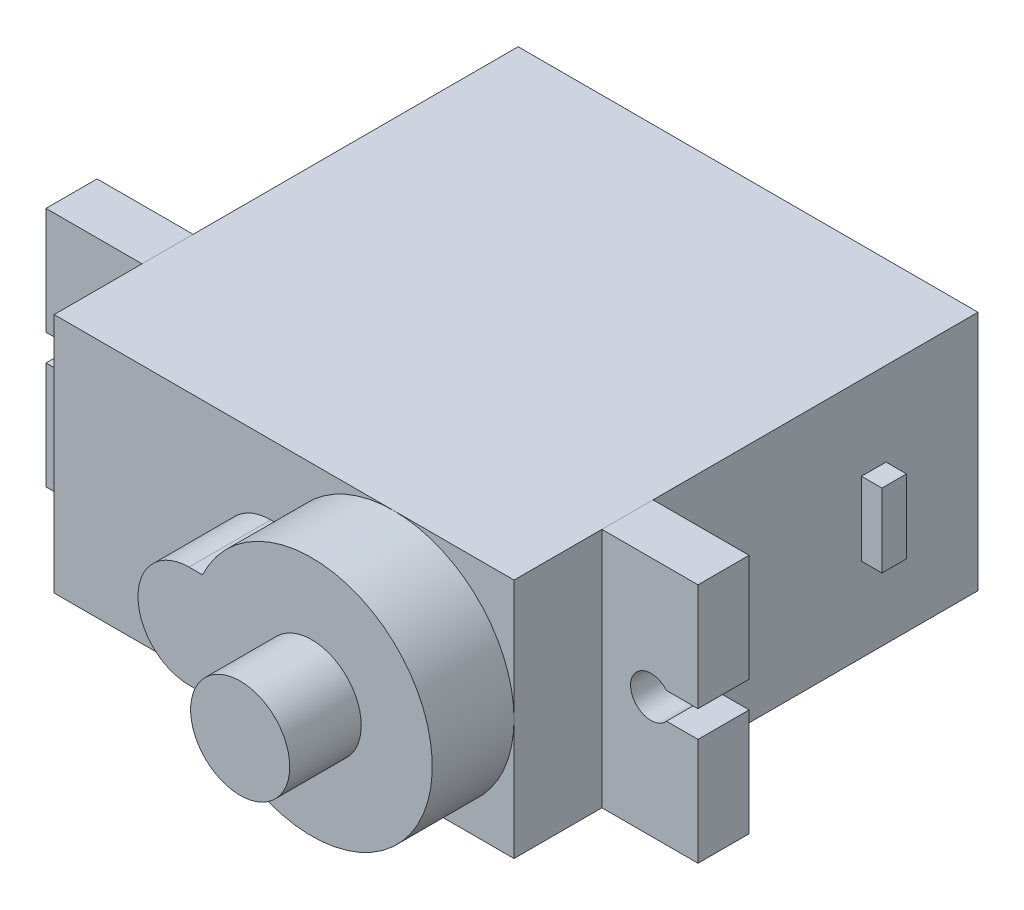
ISO-10303-21;
HEADER;
FILE_DESCRIPTION(('STEP AP214'),'2;1');
FILE_NAME('part.step','',(''),(''),'','','');
FILE_SCHEMA(('AUTOMOTIVE_DESIGN { 1 0 10303 214 1 1 1 1 }'));
ENDSEC;
DATA;
#1=APPLICATION_CONTEXT('core data for automotive mechanical design processes');
#2=APPLICATION_PROTOCOL_DEFINITION('international standard','automotive_design',2000,#1);
#3=PRODUCT_CONTEXT('',#1,'mechanical');
#4=PRODUCT('Part','Part','',(#3));
#5=PRODUCT_RELATED_PRODUCT_CATEGORY('part','',(#4));
#6=PRODUCT_DEFINITION_FORMATION('','',#4);
#7=PRODUCT_DEFINITION_CONTEXT('part definition',#1,'design');
#8=PRODUCT_DEFINITION('design','',#6,#7);
#9=PRODUCT_DEFINITION_SHAPE('','',#8);
#10=(LENGTH_UNIT() NAMED_UNIT(*) SI_UNIT(.MILLI.,.METRE.));
#11=(NAMED_UNIT(*) PLANE_ANGLE_UNIT() SI_UNIT($,.RADIAN.));
#12=(NAMED_UNIT(*) SI_UNIT($,.STERADIAN.) SOLID_ANGLE_UNIT());
#13=UNCERTAINTY_MEASURE_WITH_UNIT(LENGTH_MEASURE(1.E-05),#10,'distance_accuracy_value','');
#14=(GEOMETRIC_REPRESENTATION_CONTEXT(3) GLOBAL_UNCERTAINTY_ASSIGNED_CONTEXT((#13)) GLOBAL_UNIT_ASSIGNED_CONTEXT((#10,
#11,#12)) REPRESENTATION_CONTEXT('',''));
#15=CARTESIAN_POINT('',(0.,0.,0.));
#16=DIRECTION('',(0.,0.,1.));
#17=DIRECTION('',(1.,0.,0.));
#18=AXIS2_PLACEMENT_3D('',#15,#16,#17);
#19=CARTESIAN_POINT('',(13.65,0.,18.4));
#20=DIRECTION('',(0.,0.,-1.));
#21=DIRECTION('',(-1.,0.,0.));
#22=AXIS2_PLACEMENT_3D('',#19,#20,#21);
#23=CYLINDRICAL_SURFACE('',#22,1.);
#24=CARTESIAN_POINT('',(13.65,0.,15.9));
#25=DIRECTION('',(0.,0.,-1.));
#26=DIRECTION('',(-1.,0.,0.));
#27=AXIS2_PLACEMENT_3D('',#24,#25,#26);
#28=CIRCLE('',#27,1.);
#29=CARTESIAN_POINT('',(14.4099342076785,-0.650000000000027,15.9));
#30=VERTEX_POINT('',#29);
#31=CARTESIAN_POINT('',(14.4099342076785,0.649999999999973,15.9));
#32=VERTEX_POINT('',#31);
#33=EDGE_CURVE('E12',#30,#32,#28,.T.);
#34=ORIENTED_EDGE('',*,*,#33,.T.);
#35=DIRECTION('',(0.,0.,-1.));
#36=VECTOR('',#35,1.);
#37=CARTESIAN_POINT('',(14.4099342076785,0.649999999999973,18.4));
#38=LINE('',#37,#36);
#39=CARTESIAN_POINT('',(14.4099342076785,0.649999999999973,18.4));
#40=VERTEX_POINT('',#39);
#41=EDGE_CURVE('E184',#40,#32,#38,.T.);
#42=ORIENTED_EDGE('',*,*,#41,.F.);
#43=CARTESIAN_POINT('',(13.65,0.,18.4));
#44=DIRECTION('',(0.,0.,-1.));
#45=DIRECTION('',(-1.,0.,0.));
#46=AXIS2_PLACEMENT_3D('',#43,#44,#45);
#47=CIRCLE('',#46,1.);
#48=CARTESIAN_POINT('',(14.4099342076785,-0.650000000000027,18.4));
#49=VERTEX_POINT('',#48);
#50=EDGE_CURVE('E52',#49,#40,#47,.T.);
#51=ORIENTED_EDGE('',*,*,#50,.F.);
#52=DIRECTION('',(0.,0.,-1.));
#53=VECTOR('',#52,1.);
#54=CARTESIAN_POINT('',(14.4099342076785,-0.650000000000027,18.4));
#55=LINE('',#54,#53);
#56=EDGE_CURVE('E152',#49,#30,#55,.T.);
#57=ORIENTED_EDGE('',*,*,#56,.T.);
#58=EDGE_LOOP('',(#34,#42,#51,#57));
#59=FACE_BOUND('',#58,.T.);
#60=ADVANCED_FACE('F48',(#59),#23,.F.);
#61=CARTESIAN_POINT('',(15.95,0.64999999999997,18.4));
#62=DIRECTION('',(0.,1.,0.));
#63=DIRECTION('',(-1.,0.,0.));
#64=AXIS2_PLACEMENT_3D('',#61,#62,#63);
#65=PLANE('',#64);
#66=DIRECTION('',(1.,0.,0.));
#67=VECTOR('',#66,1.);
#68=CARTESIAN_POINT('',(15.95,0.64999999999997,15.9));
#69=LINE('',#68,#67);
#70=CARTESIAN_POINT('',(15.95,0.64999999999997,15.9));
#71=VERTEX_POINT('',#70);
#72=EDGE_CURVE('E58',#32,#71,#69,.T.);
#73=ORIENTED_EDGE('',*,*,#72,.T.);
#74=DIRECTION('',(0.,0.,-1.));
#75=VECTOR('',#74,1.);
#76=CARTESIAN_POINT('',(15.95,0.64999999999997,18.4));
#77=LINE('',#76,#75);
#78=CARTESIAN_POINT('',(15.95,0.64999999999997,18.4));
#79=VERTEX_POINT('',#78);
#80=EDGE_CURVE('E128',#79,#71,#77,.T.);
#81=ORIENTED_EDGE('',*,*,#80,.F.);
#82=DIRECTION('',(1.,0.,0.));
#83=VECTOR('',#82,1.);
#84=CARTESIAN_POINT('',(15.95,0.64999999999997,18.4));
#85=LINE('',#84,#83);
#86=EDGE_CURVE('E94',#40,#79,#85,.T.);
#87=ORIENTED_EDGE('',*,*,#86,.F.);
#88=ORIENTED_EDGE('',*,*,#41,.T.);
#89=EDGE_LOOP('',(#73,#81,#87,#88));
#90=FACE_BOUND('',#89,.T.);
#91=ADVANCED_FACE('F190',(#90),#65,.F.);
#92=CARTESIAN_POINT('',(15.95,5.89999999999997,18.4));
#93=DIRECTION('',(-1.,0.,0.));
#94=DIRECTION('',(0.,-1.,0.));
#95=AXIS2_PLACEMENT_3D('',#92,#93,#94);
#96=PLANE('',#95);
#97=DIRECTION('',(0.,1.,0.));
#98=VECTOR('',#97,1.);
#99=CARTESIAN_POINT('',(15.95,5.89999999999997,15.9));
#100=LINE('',#99,#98);
#101=CARTESIAN_POINT('',(15.95,5.89999999999997,15.9));
#102=VERTEX_POINT('',#101);
#103=EDGE_CURVE('E122',#71,#102,#100,.T.);
#104=ORIENTED_EDGE('',*,*,#103,.T.);
#105=DIRECTION('',(0.,0.,-1.));
#106=VECTOR('',#105,1.);
#107=CARTESIAN_POINT('',(15.95,5.89999999999997,18.4));
#108=LINE('',#107,#106);
#109=CARTESIAN_POINT('',(15.95,5.89999999999997,18.4));
#110=VERTEX_POINT('',#109);
#111=EDGE_CURVE('E126',#110,#102,#108,.T.);
#112=ORIENTED_EDGE('',*,*,#111,.F.);
#113=DIRECTION('',(0.,1.,0.));
#114=VECTOR('',#113,1.);
#115=CARTESIAN_POINT('',(15.95,5.89999999999997,18.4));
#116=LINE('',#115,#114);
#117=EDGE_CURVE('E159',#79,#110,#116,.T.);
#118=ORIENTED_EDGE('',*,*,#117,.F.);
#119=ORIENTED_EDGE('',*,*,#80,.T.);
#120=EDGE_LOOP('',(#104,#112,#118,#119));
#121=FACE_BOUND('',#120,.T.);
#122=ADVANCED_FACE('F124',(#121),#96,.F.);
#123=CARTESIAN_POINT('',(11.25,5.89999999999998,18.4));
#124=DIRECTION('',(0.,-1.,0.));
#125=DIRECTION('',(1.,0.,0.));
#126=AXIS2_PLACEMENT_3D('',#123,#124,#125);
#127=PLANE('',#126);
#128=DIRECTION('',(-1.,0.,0.));
#129=VECTOR('',#128,1.);
#130=CARTESIAN_POINT('',(11.25,5.89999999999998,15.9));
#131=LINE('',#130,#129);
#132=CARTESIAN_POINT('',(11.25,5.89999999999998,15.9));
#133=VERTEX_POINT('',#132);
#134=EDGE_CURVE('E130',#102,#133,#131,.T.);
#135=ORIENTED_EDGE('',*,*,#134,.T.);
#136=DIRECTION('',(0.,0.,-1.));
#137=VECTOR('',#136,1.);
#138=CARTESIAN_POINT('',(11.25,5.89999999999998,18.4));
#139=LINE('',#138,#137);
#140=CARTESIAN_POINT('',(11.25,5.89999999999998,18.4));
#141=VERTEX_POINT('',#140);
#142=EDGE_CURVE('E137',#141,#133,#139,.T.);
#143=ORIENTED_EDGE('',*,*,#142,.F.);
#144=DIRECTION('',(-1.,0.,0.));
#145=VECTOR('',#144,1.);
#146=CARTESIAN_POINT('',(11.25,5.89999999999998,18.4));
#147=LINE('',#146,#145);
#148=EDGE_CURVE('E136',#110,#141,#147,.T.);
#149=ORIENTED_EDGE('',*,*,#148,.F.);
#150=ORIENTED_EDGE('',*,*,#111,.T.);
#151=EDGE_LOOP('',(#135,#143,#149,#150));
#152=FACE_BOUND('',#151,.T.);
#153=ADVANCED_FACE('F133',(#152),#127,.F.);
#154=CARTESIAN_POINT('',(11.25,5.89999999999998,18.4));
#155=DIRECTION('',(1.,0.,0.));
#156=DIRECTION('',(0.,1.,0.));
#157=AXIS2_PLACEMENT_3D('',#154,#155,#156);
#158=PLANE('',#157);
#159=DIRECTION('',(0.,-1.,0.));
#160=VECTOR('',#159,1.);
#161=CARTESIAN_POINT('',(11.25,5.89999999999998,15.9));
#162=LINE('',#161,#160);
#163=CARTESIAN_POINT('',(11.25,-5.90000000000002,15.9));
#164=VERTEX_POINT('',#163);
#165=EDGE_CURVE('E142',#133,#164,#162,.T.);
#166=ORIENTED_EDGE('',*,*,#165,.T.);
#167=DIRECTION('',(0.,0.,-1.));
#168=VECTOR('',#167,1.);
#169=CARTESIAN_POINT('',(11.25,-5.90000000000002,18.4));
#170=LINE('',#169,#168);
#171=CARTESIAN_POINT('',(11.25,-5.90000000000002,18.4));
#172=VERTEX_POINT('',#171);
#173=EDGE_CURVE('E176',#172,#164,#170,.T.);
#174=ORIENTED_EDGE('',*,*,#173,.F.);
#175=DIRECTION('',(0.,-1.,0.));
#176=VECTOR('',#175,1.);
#177=CARTESIAN_POINT('',(11.25,5.89999999999998,18.4));
#178=LINE('',#177,#176);
#179=EDGE_CURVE('E156',#141,#172,#178,.T.);
#180=ORIENTED_EDGE('',*,*,#179,.F.);
#181=ORIENTED_EDGE('',*,*,#142,.T.);
#182=EDGE_LOOP('',(#166,#174,#180,#181));
#183=FACE_BOUND('',#182,.T.);
#184=ADVANCED_FACE('F193',(#183),#158,.F.);
#185=CARTESIAN_POINT('',(11.25,-5.90000000000002,18.4));
#186=DIRECTION('',(0.,1.,0.));
#187=DIRECTION('',(-1.,0.,0.));
#188=AXIS2_PLACEMENT_3D('',#185,#186,#187);
#189=PLANE('',#188);
#190=DIRECTION('',(1.,0.,0.));
#191=VECTOR('',#190,1.);
#192=CARTESIAN_POINT('',(11.25,-5.90000000000002,15.9));
#193=LINE('',#192,#191);
#194=CARTESIAN_POINT('',(15.95,-5.90000000000003,15.9));
#195=VERTEX_POINT('',#194);
#196=EDGE_CURVE('E144',#164,#195,#193,.T.);
#197=ORIENTED_EDGE('',*,*,#196,.T.);
#198=DIRECTION('',(0.,0.,-1.));
#199=VECTOR('',#198,1.);
#200=CARTESIAN_POINT('',(15.95,-5.90000000000003,18.4));
#201=LINE('',#200,#199);
#202=CARTESIAN_POINT('',(15.95,-5.90000000000003,18.4));
#203=VERTEX_POINT('',#202);
#204=EDGE_CURVE('E173',#203,#195,#201,.T.);
#205=ORIENTED_EDGE('',*,*,#204,.F.);
#206=DIRECTION('',(1.,0.,0.));
#207=VECTOR('',#206,1.);
#208=CARTESIAN_POINT('',(11.25,-5.90000000000002,18.4));
#209=LINE('',#208,#207);
#210=EDGE_CURVE('E154',#172,#203,#209,.T.);
#211=ORIENTED_EDGE('',*,*,#210,.F.);
#212=ORIENTED_EDGE('',*,*,#173,.T.);
#213=EDGE_LOOP('',(#197,#205,#211,#212));
#214=FACE_BOUND('',#213,.T.);
#215=ADVANCED_FACE('F171',(#214),#189,.F.);
#216=CARTESIAN_POINT('',(15.95,-0.65000000000003,18.4));
#217=DIRECTION('',(-1.,0.,0.));
#218=DIRECTION('',(0.,-1.,0.));
#219=AXIS2_PLACEMENT_3D('',#216,#217,#218);
#220=PLANE('',#219);
#221=DIRECTION('',(0.,1.,0.));
#222=VECTOR('',#221,1.);
#223=CARTESIAN_POINT('',(15.95,-0.65000000000003,15.9));
#224=LINE('',#223,#222);
#225=CARTESIAN_POINT('',(15.95,-0.65000000000003,15.9));
#226=VERTEX_POINT('',#225);
#227=EDGE_CURVE('E162',#195,#226,#224,.T.);
#228=ORIENTED_EDGE('',*,*,#227,.T.);
#229=DIRECTION('',(0.,0.,-1.));
#230=VECTOR('',#229,1.);
#231=CARTESIAN_POINT('',(15.95,-0.65000000000003,18.4));
#232=LINE('',#231,#230);
#233=CARTESIAN_POINT('',(15.95,-0.65000000000003,18.4));
#234=VERTEX_POINT('',#233);
#235=EDGE_CURVE('E181',#234,#226,#232,.T.);
#236=ORIENTED_EDGE('',*,*,#235,.F.);
#237=DIRECTION('',(0.,1.,0.));
#238=VECTOR('',#237,1.);
#239=CARTESIAN_POINT('',(15.95,-0.65000000000003,18.4));
#240=LINE('',#239,#238);
#241=EDGE_CURVE('E151',#203,#234,#240,.T.);
#242=ORIENTED_EDGE('',*,*,#241,.F.);
#243=ORIENTED_EDGE('',*,*,#204,.T.);
#244=EDGE_LOOP('',(#228,#236,#242,#243));
#245=FACE_BOUND('',#244,.T.);
#246=ADVANCED_FACE('F179',(#245),#220,.F.);
#247=CARTESIAN_POINT('',(14.4099342076785,-0.650000000000027,18.4));
#248=DIRECTION('',(0.,-1.,0.));
#249=DIRECTION('',(1.,0.,0.));
#250=AXIS2_PLACEMENT_3D('',#247,#248,#249);
#251=PLANE('',#250);
#252=DIRECTION('',(-1.,0.,0.));
#253=VECTOR('',#252,1.);
#254=CARTESIAN_POINT('',(14.4099342076785,-0.650000000000027,15.9));
#255=LINE('',#254,#253);
#256=EDGE_CURVE('E105',#226,#30,#255,.T.);
#257=ORIENTED_EDGE('',*,*,#256,.T.);
#258=ORIENTED_EDGE('',*,*,#56,.F.);
#259=DIRECTION('',(-1.,0.,0.));
#260=VECTOR('',#259,1.);
#261=CARTESIAN_POINT('',(14.4099342076785,-0.650000000000027,18.4));
#262=LINE('',#261,#260);
#263=EDGE_CURVE('E149',#234,#49,#262,.T.);
#264=ORIENTED_EDGE('',*,*,#263,.F.);
#265=ORIENTED_EDGE('',*,*,#235,.T.);
#266=EDGE_LOOP('',(#257,#258,#264,#265));
#267=FACE_BOUND('',#266,.T.);
#268=ADVANCED_FACE('F194',(#267),#251,.F.);
#269=CARTESIAN_POINT('',(13.65,0.,18.4));
#270=DIRECTION('',(0.,0.,-1.));
#271=DIRECTION('',(-1.,0.,0.));
#272=AXIS2_PLACEMENT_3D('',#269,#270,#271);
#273=PLANE('',#272);
#274=ORIENTED_EDGE('',*,*,#50,.T.);
#275=ORIENTED_EDGE('',*,*,#86,.T.);
#276=ORIENTED_EDGE('',*,*,#117,.T.);
#277=ORIENTED_EDGE('',*,*,#148,.T.);
#278=ORIENTED_EDGE('',*,*,#179,.T.);
#279=ORIENTED_EDGE('',*,*,#210,.T.);
#280=ORIENTED_EDGE('',*,*,#241,.T.);
#281=ORIENTED_EDGE('',*,*,#263,.T.);
#282=EDGE_LOOP('',(#274,#275,#276,#277,#278,#279,#280,#281));
#283=FACE_BOUND('',#282,.T.);
#284=ADVANCED_FACE('F50',(#283),#273,.F.);
#285=CARTESIAN_POINT('',(13.65,0.,15.9));
#286=DIRECTION('',(0.,0.,-1.));
#287=DIRECTION('',(-1.,0.,0.));
#288=AXIS2_PLACEMENT_3D('',#285,#286,#287);
#289=PLANE('',#288);
#290=ORIENTED_EDGE('',*,*,#33,.F.);
#291=ORIENTED_EDGE('',*,*,#256,.F.);
#292=ORIENTED_EDGE('',*,*,#227,.F.);
#293=ORIENTED_EDGE('',*,*,#196,.F.);
#294=ORIENTED_EDGE('',*,*,#165,.F.);
#295=ORIENTED_EDGE('',*,*,#134,.F.);
#296=ORIENTED_EDGE('',*,*,#103,.F.);
#297=ORIENTED_EDGE('',*,*,#72,.F.);
#298=EDGE_LOOP('',(#290,#291,#292,#293,#294,#295,#296,#297));
#299=FACE_BOUND('',#298,.T.);
#300=ADVANCED_FACE('F140',(#299),#289,.T.);
#301=CLOSED_SHELL('',(#60,#91,#122,#153,#184,#215,#246,#268,#284,#300));
#302=MANIFOLD_SOLID_BREP('B2',#301);
#303=CARTESIAN_POINT('',(-11.25,5.9,18.4));
#304=DIRECTION('',(-1.,0.,0.));
#305=DIRECTION('',(0.,0.,1.));
#306=AXIS2_PLACEMENT_3D('',#303,#304,#305);
#307=PLANE('',#306);
#308=DIRECTION('',(0.,1.,0.));
#309=VECTOR('',#308,1.);
#310=CARTESIAN_POINT('',(-11.25,5.9,15.9));
#311=LINE('',#310,#309);
#312=CARTESIAN_POINT('',(-11.25,-5.9,15.9));
#313=VERTEX_POINT('',#312);
#314=CARTESIAN_POINT('',(-11.25,5.9,15.9));
#315=VERTEX_POINT('',#314);
#316=EDGE_CURVE('E401',#313,#315,#311,.T.);
#317=ORIENTED_EDGE('',*,*,#316,.T.);
#318=DIRECTION('',(0.,0.,-1.));
#319=VECTOR('',#318,1.);
#320=CARTESIAN_POINT('',(-11.25,5.9,18.4));
#321=LINE('',#320,#319);
#322=CARTESIAN_POINT('',(-11.25,5.9,18.4));
#323=VERTEX_POINT('',#322);
#324=EDGE_CURVE('E46',#323,#315,#321,.T.);
#325=ORIENTED_EDGE('',*,*,#324,.F.);
#326=DIRECTION('',(0.,1.,0.));
#327=VECTOR('',#326,1.);
#328=CARTESIAN_POINT('',(-11.25,5.9,18.4));
#329=LINE('',#328,#327);
#330=CARTESIAN_POINT('',(-11.25,-5.9,18.4));
#331=VERTEX_POINT('',#330);
#332=EDGE_CURVE('E415',#331,#323,#329,.T.);
#333=ORIENTED_EDGE('',*,*,#332,.F.);
#334=DIRECTION('',(0.,0.,-1.));
#335=VECTOR('',#334,1.);
#336=CARTESIAN_POINT('',(-11.25,-5.9,18.4));
#337=LINE('',#336,#335);
#338=EDGE_CURVE('E397',#331,#313,#337,.T.);
#339=ORIENTED_EDGE('',*,*,#338,.T.);
#340=EDGE_LOOP('',(#317,#325,#333,#339));
#341=FACE_BOUND('',#340,.T.);
#342=ADVANCED_FACE('F305',(#341),#307,.F.);
#343=CARTESIAN_POINT('',(-11.25,5.9,18.4));
#344=DIRECTION('',(0.,-1.,0.));
#345=DIRECTION('',(1.,0.,0.));
#346=AXIS2_PLACEMENT_3D('',#343,#344,#345);
#347=PLANE('',#346);
#348=DIRECTION('',(-1.,0.,0.));
#349=VECTOR('',#348,1.);
#350=CARTESIAN_POINT('',(-11.25,5.9,15.9));
#351=LINE('',#350,#349);
#352=CARTESIAN_POINT('',(-15.95,5.9,15.9));
#353=VERTEX_POINT('',#352);
#354=EDGE_CURVE('E404',#315,#353,#351,.T.);
#355=ORIENTED_EDGE('',*,*,#354,.T.);
#356=DIRECTION('',(0.,0.,-1.));
#357=VECTOR('',#356,1.);
#358=CARTESIAN_POINT('',(-15.95,5.9,18.4));
#359=LINE('',#358,#357);
#360=CARTESIAN_POINT('',(-15.95,5.9,18.4));
#361=VERTEX_POINT('',#360);
#362=EDGE_CURVE('E313',#361,#353,#359,.T.);
#363=ORIENTED_EDGE('',*,*,#362,.F.);
#364=DIRECTION('',(-1.,0.,0.));
#365=VECTOR('',#364,1.);
#366=CARTESIAN_POINT('',(-11.25,5.9,18.4));
#367=LINE('',#366,#365);
#368=EDGE_CURVE('E364',#323,#361,#367,.T.);
#369=ORIENTED_EDGE('',*,*,#368,.F.);
#370=ORIENTED_EDGE('',*,*,#324,.T.);
#371=EDGE_LOOP('',(#355,#363,#369,#370));
#372=FACE_BOUND('',#371,.T.);
#373=ADVANCED_FACE('F450',(#372),#347,.F.);
#374=CARTESIAN_POINT('',(-15.95,5.9,18.4));
#375=DIRECTION('',(1.,0.,0.));
#376=DIRECTION('',(0.,1.,0.));
#377=AXIS2_PLACEMENT_3D('',#374,#375,#376);
#378=PLANE('',#377);
#379=DIRECTION('',(0.,-1.,0.));
#380=VECTOR('',#379,1.);
#381=CARTESIAN_POINT('',(-15.95,5.9,15.9));
#382=LINE('',#381,#380);
#383=CARTESIAN_POINT('',(-15.95,0.649999999999998,15.9));
#384=VERTEX_POINT('',#383);
#385=EDGE_CURVE('E406',#353,#384,#382,.T.);
#386=ORIENTED_EDGE('',*,*,#385,.T.);
#387=DIRECTION('',(0.,0.,-1.));
#388=VECTOR('',#387,1.);
#389=CARTESIAN_POINT('',(-15.95,0.649999999999998,18.4));
#390=LINE('',#389,#388);
#391=CARTESIAN_POINT('',(-15.95,0.649999999999998,18.4));
#392=VERTEX_POINT('',#391);
#393=EDGE_CURVE('E422',#392,#384,#390,.T.);
#394=ORIENTED_EDGE('',*,*,#393,.F.);
#395=DIRECTION('',(0.,-1.,0.));
#396=VECTOR('',#395,1.);
#397=CARTESIAN_POINT('',(-15.95,5.9,18.4));
#398=LINE('',#397,#396);
#399=EDGE_CURVE('E430',#361,#392,#398,.T.);
#400=ORIENTED_EDGE('',*,*,#399,.F.);
#401=ORIENTED_EDGE('',*,*,#362,.T.);
#402=EDGE_LOOP('',(#386,#394,#400,#401));
#403=FACE_BOUND('',#402,.T.);
#404=ADVANCED_FACE('F428',(#403),#378,.F.);
#405=CARTESIAN_POINT('',(-15.95,0.649999999999998,18.4));
#406=DIRECTION('',(0.,1.,0.));
#407=DIRECTION('',(0.,0.,1.));
#408=AXIS2_PLACEMENT_3D('',#405,#406,#407);
#409=PLANE('',#408);
#410=DIRECTION('',(1.,0.,0.));
#411=VECTOR('',#410,1.);
#412=CARTESIAN_POINT('',(-15.95,0.649999999999998,15.9));
#413=LINE('',#412,#411);
#414=CARTESIAN_POINT('',(-14.4099342076785,0.649999999999998,15.9));
#415=VERTEX_POINT('',#414);
#416=EDGE_CURVE('E408',#384,#415,#413,.T.);
#417=ORIENTED_EDGE('',*,*,#416,.T.);
#418=DIRECTION('',(0.,0.,-1.));
#419=VECTOR('',#418,1.);
#420=CARTESIAN_POINT('',(-14.4099342076785,0.649999999999998,18.4));
#421=LINE('',#420,#419);
#422=CARTESIAN_POINT('',(-14.4099342076785,0.649999999999998,18.4));
#423=VERTEX_POINT('',#422);
#424=EDGE_CURVE('E419',#423,#415,#421,.T.);
#425=ORIENTED_EDGE('',*,*,#424,.F.);
#426=DIRECTION('',(1.,0.,0.));
#427=VECTOR('',#426,1.);
#428=CARTESIAN_POINT('',(-15.95,0.649999999999998,18.4));
#429=LINE('',#428,#427);
#430=EDGE_CURVE('E442',#392,#423,#429,.T.);
#431=ORIENTED_EDGE('',*,*,#430,.F.);
#432=ORIENTED_EDGE('',*,*,#393,.T.);
#433=EDGE_LOOP('',(#417,#425,#431,#432));
#434=FACE_BOUND('',#433,.T.);
#435=ADVANCED_FACE('F438',(#434),#409,.F.);
#436=CARTESIAN_POINT('',(-13.65,0.,18.4));
#437=DIRECTION('',(0.,0.,-1.));
#438=DIRECTION('',(-1.,0.,0.));
#439=AXIS2_PLACEMENT_3D('',#436,#437,#438);
#440=CYLINDRICAL_SURFACE('',#439,1.);
#441=CARTESIAN_POINT('',(-13.65,0.,15.9));
#442=DIRECTION('',(0.,0.,-1.));
#443=DIRECTION('',(1.,0.,0.));
#444=AXIS2_PLACEMENT_3D('',#441,#442,#443);
#445=CIRCLE('',#444,1.);
#446=CARTESIAN_POINT('',(-14.4099342076785,-0.650000000000002,15.9));
#447=VERTEX_POINT('',#446);
#448=EDGE_CURVE('E410',#415,#447,#445,.T.);
#449=ORIENTED_EDGE('',*,*,#448,.T.);
#450=DIRECTION('',(0.,0.,-1.));
#451=VECTOR('',#450,1.);
#452=CARTESIAN_POINT('',(-14.4099342076785,-0.650000000000002,18.4));
#453=LINE('',#452,#451);
#454=CARTESIAN_POINT('',(-14.4099342076785,-0.650000000000002,18.4));
#455=VERTEX_POINT('',#454);
#456=EDGE_CURVE('E392',#455,#447,#453,.T.);
#457=ORIENTED_EDGE('',*,*,#456,.F.);
#458=CARTESIAN_POINT('',(-13.65,0.,18.4));
#459=DIRECTION('',(0.,0.,-1.));
#460=DIRECTION('',(1.,0.,0.));
#461=AXIS2_PLACEMENT_3D('',#458,#459,#460);
#462=CIRCLE('',#461,1.);
#463=EDGE_CURVE('E383',#423,#455,#462,.T.);
#464=ORIENTED_EDGE('',*,*,#463,.F.);
#465=ORIENTED_EDGE('',*,*,#424,.T.);
#466=EDGE_LOOP('',(#449,#457,#464,#465));
#467=FACE_BOUND('',#466,.T.);
#468=ADVANCED_FACE('F441',(#467),#440,.F.);
#469=CARTESIAN_POINT('',(-14.4099342076785,-0.650000000000002,18.4));
#470=DIRECTION('',(0.,-1.,0.));
#471=DIRECTION('',(1.,0.,0.));
#472=AXIS2_PLACEMENT_3D('',#469,#470,#471);
#473=PLANE('',#472);
#474=DIRECTION('',(-1.,0.,0.));
#475=VECTOR('',#474,1.);
#476=CARTESIAN_POINT('',(-14.4099342076785,-0.650000000000002,15.9));
#477=LINE('',#476,#475);
#478=CARTESIAN_POINT('',(-15.95,-0.650000000000002,15.9));
#479=VERTEX_POINT('',#478);
#480=EDGE_CURVE('E391',#447,#479,#477,.T.);
#481=ORIENTED_EDGE('',*,*,#480,.T.);
#482=DIRECTION('',(0.,0.,-1.));
#483=VECTOR('',#482,1.);
#484=CARTESIAN_POINT('',(-15.95,-0.650000000000002,18.4));
#485=LINE('',#484,#483);
#486=CARTESIAN_POINT('',(-15.95,-0.650000000000002,18.4));
#487=VERTEX_POINT('',#486);
#488=EDGE_CURVE('E388',#487,#479,#485,.T.);
#489=ORIENTED_EDGE('',*,*,#488,.F.);
#490=DIRECTION('',(-1.,0.,0.));
#491=VECTOR('',#490,1.);
#492=CARTESIAN_POINT('',(-14.4099342076785,-0.650000000000002,18.4));
#493=LINE('',#492,#491);
#494=EDGE_CURVE('E377',#455,#487,#493,.T.);
#495=ORIENTED_EDGE('',*,*,#494,.F.);
#496=ORIENTED_EDGE('',*,*,#456,.T.);
#497=EDGE_LOOP('',(#481,#489,#495,#496));
#498=FACE_BOUND('',#497,.T.);
#499=ADVANCED_FACE('F389',(#498),#473,.F.);
#500=CARTESIAN_POINT('',(-15.95,-0.650000000000002,18.4));
#501=DIRECTION('',(1.,0.,0.));
#502=DIRECTION('',(0.,0.,-1.));
#503=AXIS2_PLACEMENT_3D('',#500,#501,#502);
#504=PLANE('',#503);
#505=DIRECTION('',(0.,-1.,0.));
#506=VECTOR('',#505,1.);
#507=CARTESIAN_POINT('',(-15.95,-0.650000000000002,15.9));
#508=LINE('',#507,#506);
#509=CARTESIAN_POINT('',(-15.95,-5.9,15.9));
#510=VERTEX_POINT('',#509);
#511=EDGE_CURVE('E350',#479,#510,#508,.T.);
#512=ORIENTED_EDGE('',*,*,#511,.T.);
#513=DIRECTION('',(0.,0.,-1.));
#514=VECTOR('',#513,1.);
#515=CARTESIAN_POINT('',(-15.95,-5.9,18.4));
#516=LINE('',#515,#514);
#517=CARTESIAN_POINT('',(-15.95,-5.9,18.4));
#518=VERTEX_POINT('',#517);
#519=EDGE_CURVE('E393',#518,#510,#516,.T.);
#520=ORIENTED_EDGE('',*,*,#519,.F.);
#521=DIRECTION('',(0.,-1.,0.));
#522=VECTOR('',#521,1.);
#523=CARTESIAN_POINT('',(-15.95,-0.650000000000002,18.4));
#524=LINE('',#523,#522);
#525=EDGE_CURVE('E381',#487,#518,#524,.T.);
#526=ORIENTED_EDGE('',*,*,#525,.F.);
#527=ORIENTED_EDGE('',*,*,#488,.T.);
#528=EDGE_LOOP('',(#512,#520,#526,#527));
#529=FACE_BOUND('',#528,.T.);
#530=ADVANCED_FACE('F395',(#529),#504,.F.);
#531=CARTESIAN_POINT('',(-11.25,-5.9,18.4));
#532=DIRECTION('',(0.,1.,0.));
#533=DIRECTION('',(-1.,0.,0.));
#534=AXIS2_PLACEMENT_3D('',#531,#532,#533);
#535=PLANE('',#534);
#536=DIRECTION('',(1.,0.,0.));
#537=VECTOR('',#536,1.);
#538=CARTESIAN_POINT('',(-11.25,-5.9,15.9));
#539=LINE('',#538,#537);
#540=EDGE_CURVE('E356',#510,#313,#539,.T.);
#541=ORIENTED_EDGE('',*,*,#540,.T.);
#542=ORIENTED_EDGE('',*,*,#338,.F.);
#543=DIRECTION('',(1.,0.,0.));
#544=VECTOR('',#543,1.);
#545=CARTESIAN_POINT('',(-11.25,-5.9,18.4));
#546=LINE('',#545,#544);
#547=EDGE_CURVE('E321',#518,#331,#546,.T.);
#548=ORIENTED_EDGE('',*,*,#547,.F.);
#549=ORIENTED_EDGE('',*,*,#519,.T.);
#550=EDGE_LOOP('',(#541,#542,#548,#549));
#551=FACE_BOUND('',#550,.T.);
#552=ADVANCED_FACE('F466',(#551),#535,.F.);
#553=CARTESIAN_POINT('',(-13.65,0.,18.4));
#554=DIRECTION('',(0.,0.,1.));
#555=DIRECTION('',(1.,0.,0.));
#556=AXIS2_PLACEMENT_3D('',#553,#554,#555);
#557=PLANE('',#556);
#558=ORIENTED_EDGE('',*,*,#332,.T.);
#559=ORIENTED_EDGE('',*,*,#368,.T.);
#560=ORIENTED_EDGE('',*,*,#399,.T.);
#561=ORIENTED_EDGE('',*,*,#430,.T.);
#562=ORIENTED_EDGE('',*,*,#463,.T.);
#563=ORIENTED_EDGE('',*,*,#494,.T.);
#564=ORIENTED_EDGE('',*,*,#525,.T.);
#565=ORIENTED_EDGE('',*,*,#547,.T.);
#566=EDGE_LOOP('',(#558,#559,#560,#561,#562,#563,#564,#565));
#567=FACE_BOUND('',#566,.T.);
#568=ADVANCED_FACE('F379',(#567),#557,.T.);
#569=CARTESIAN_POINT('',(-13.65,0.,15.9));
#570=DIRECTION('',(0.,0.,1.));
#571=DIRECTION('',(1.,0.,0.));
#572=AXIS2_PLACEMENT_3D('',#569,#570,#571);
#573=PLANE('',#572);
#574=ORIENTED_EDGE('',*,*,#316,.F.);
#575=ORIENTED_EDGE('',*,*,#540,.F.);
#576=ORIENTED_EDGE('',*,*,#511,.F.);
#577=ORIENTED_EDGE('',*,*,#480,.F.);
#578=ORIENTED_EDGE('',*,*,#448,.F.);
#579=ORIENTED_EDGE('',*,*,#416,.F.);
#580=ORIENTED_EDGE('',*,*,#385,.F.);
#581=ORIENTED_EDGE('',*,*,#354,.F.);
#582=EDGE_LOOP('',(#574,#575,#576,#577,#578,#579,#580,#581));
#583=FACE_BOUND('',#582,.T.);
#584=ADVANCED_FACE('F434',(#583),#573,.F.);
#585=CLOSED_SHELL('',(#342,#373,#404,#435,#468,#499,#530,#552,#568,#584));
#586=MANIFOLD_SOLID_BREP('B6',#585);
#587=CARTESIAN_POINT('',(11.25,-5.9,15.9));
#588=DIRECTION('',(-1.,0.,0.));
#589=DIRECTION('',(0.,0.,1.));
#590=AXIS2_PLACEMENT_3D('',#587,#588,#589);
#591=PLANE('',#590);
#592=DIRECTION('',(0.,1.,0.));
#593=VECTOR('',#592,1.);
#594=CARTESIAN_POINT('',(11.25,-5.9,0.));
#595=LINE('',#594,#593);
#596=CARTESIAN_POINT('',(11.25,-5.9,0.));
#597=VERTEX_POINT('',#596);
#598=CARTESIAN_POINT('',(11.25,5.9,0.));
#599=VERTEX_POINT('',#598);
#600=EDGE_CURVE('E730',#597,#599,#595,.T.);
#601=ORIENTED_EDGE('',*,*,#600,.T.);
#602=DIRECTION('',(0.,0.,-1.));
#603=VECTOR('',#602,1.);
#604=CARTESIAN_POINT('',(11.25,5.9,15.9));
#605=LINE('',#604,#603);
#606=CARTESIAN_POINT('',(11.25,5.9,22.7));
#607=VERTEX_POINT('',#606);
#608=EDGE_CURVE('E556',#607,#599,#605,.T.);
#609=ORIENTED_EDGE('',*,*,#608,.F.);
#610=DIRECTION('',(0.,-1.,0.));
#611=VECTOR('',#610,1.);
#612=CARTESIAN_POINT('',(11.25,-5.9,22.7));
#613=LINE('',#612,#611);
#614=CARTESIAN_POINT('',(11.25,0.,22.7));
#615=VERTEX_POINT('',#614);
#616=EDGE_CURVE('E723',#607,#615,#613,.T.);
#617=ORIENTED_EDGE('',*,*,#616,.T.);
#618=CARTESIAN_POINT('',(11.25,-5.9,22.7));
#619=VERTEX_POINT('',#618);
#620=EDGE_CURVE('E722',#615,#619,#613,.T.);
#621=ORIENTED_EDGE('',*,*,#620,.T.);
#622=DIRECTION('',(0.,0.,-1.));
#623=VECTOR('',#622,1.);
#624=CARTESIAN_POINT('',(11.25,-5.9,15.9));
#625=LINE('',#624,#623);
#626=EDGE_CURVE('E739',#619,#597,#625,.T.);
#627=ORIENTED_EDGE('',*,*,#626,.T.);
#628=EDGE_LOOP('',(#601,#609,#617,#621,#627));
#629=FACE_BOUND('',#628,.T.);
#630=DIRECTION('',(0.,1.,0.));
#631=VECTOR('',#630,1.);
#632=CARTESIAN_POINT('',(11.25,-1.8,4.5));
#633=LINE('',#632,#631);
#634=CARTESIAN_POINT('',(11.25,-1.8,4.5));
#635=VERTEX_POINT('',#634);
#636=CARTESIAN_POINT('',(11.25,1.8,4.5));
#637=VERTEX_POINT('',#636);
#638=EDGE_CURVE('E672',#635,#637,#633,.T.);
#639=ORIENTED_EDGE('',*,*,#638,.F.);
#640=DIRECTION('',(0.,0.,-1.));
#641=VECTOR('',#640,1.);
#642=CARTESIAN_POINT('',(11.25,-1.8,5.7));
#643=LINE('',#642,#641);
#644=CARTESIAN_POINT('',(11.25,-1.8,5.7));
#645=VERTEX_POINT('',#644);
#646=EDGE_CURVE('E669',#645,#635,#643,.T.);
#647=ORIENTED_EDGE('',*,*,#646,.F.);
#648=DIRECTION('',(0.,-1.,0.));
#649=VECTOR('',#648,1.);
#650=CARTESIAN_POINT('',(11.25,-1.8,5.7));
#651=LINE('',#650,#649);
#652=CARTESIAN_POINT('',(11.25,1.8,5.7));
#653=VERTEX_POINT('',#652);
#654=EDGE_CURVE('E574',#653,#645,#651,.T.);
#655=ORIENTED_EDGE('',*,*,#654,.F.);
#656=DIRECTION('',(0.,0.,1.));
#657=VECTOR('',#656,1.);
#658=CARTESIAN_POINT('',(11.25,1.8,5.7));
#659=LINE('',#658,#657);
#660=EDGE_CURVE('E569',#637,#653,#659,.T.);
#661=ORIENTED_EDGE('',*,*,#660,.F.);
#662=EDGE_LOOP('',(#639,#647,#655,#661));
#663=FACE_BOUND('',#662,.T.);
#664=ADVANCED_FACE('F553',(#629,#663),#591,.F.);
#665=CARTESIAN_POINT('',(0.,0.,22.7));
#666=DIRECTION('',(0.,0.,1.));
#667=DIRECTION('',(1.,0.,0.));
#668=AXIS2_PLACEMENT_3D('',#665,#666,#667);
#669=PLANE('',#668);
#670=CARTESIAN_POINT('',(5.34999999999999,0.,22.7));
#671=DIRECTION('',(0.,0.,1.));
#672=DIRECTION('',(1.,0.,0.));
#673=AXIS2_PLACEMENT_3D('',#670,#671,#672);
#674=CIRCLE('',#673,5.9);
#675=CARTESIAN_POINT('',(0.00584431364503667,-2.5,22.7));
#676=VERTEX_POINT('',#675);
#677=CARTESIAN_POINT('',(5.34999999999999,-5.9,22.7));
#678=VERTEX_POINT('',#677);
#679=EDGE_CURVE('E676',#676,#678,#674,.T.);
#680=ORIENTED_EDGE('',*,*,#679,.F.);
#681=DIRECTION('',(1.,0.,0.));
#682=VECTOR('',#681,1.);
#683=CARTESIAN_POINT('',(-0.650000000000006,-2.5,22.7));
#684=LINE('',#683,#682);
#685=CARTESIAN_POINT('',(-0.650000000000006,-2.5,22.7));
#686=VERTEX_POINT('',#685);
#687=EDGE_CURVE('E686',#686,#676,#684,.T.);
#688=ORIENTED_EDGE('',*,*,#687,.F.);
#689=CARTESIAN_POINT('',(-0.650000000000006,0.,22.7));
#690=DIRECTION('',(0.,0.,1.));
#691=DIRECTION('',(1.,0.,0.));
#692=AXIS2_PLACEMENT_3D('',#689,#690,#691);
#693=CIRCLE('',#692,2.5);
#694=CARTESIAN_POINT('',(-0.650000000000006,2.5,22.7));
#695=VERTEX_POINT('',#694);
#696=EDGE_CURVE('E699',#695,#686,#693,.T.);
#697=ORIENTED_EDGE('',*,*,#696,.F.);
#698=DIRECTION('',(-1.,0.,0.));
#699=VECTOR('',#698,1.);
#700=CARTESIAN_POINT('',(-0.650000000000006,2.5,22.7));
#701=LINE('',#700,#699);
#702=CARTESIAN_POINT('',(0.00584431364503667,2.5,22.7));
#703=VERTEX_POINT('',#702);
#704=EDGE_CURVE('E695',#703,#695,#701,.T.);
#705=ORIENTED_EDGE('',*,*,#704,.F.);
#706=CARTESIAN_POINT('',(5.34999999999999,5.9,22.7));
#707=VERTEX_POINT('',#706);
#708=EDGE_CURVE('E696',#707,#703,#674,.T.);
#709=ORIENTED_EDGE('',*,*,#708,.F.);
#710=DIRECTION('',(1.,0.,0.));
#711=VECTOR('',#710,1.);
#712=CARTESIAN_POINT('',(11.25,5.9,22.7));
#713=LINE('',#712,#711);
#714=CARTESIAN_POINT('',(-11.25,5.9,22.7));
#715=VERTEX_POINT('',#714);
#716=EDGE_CURVE('E719',#715,#707,#713,.T.);
#717=ORIENTED_EDGE('',*,*,#716,.F.);
#718=DIRECTION('',(0.,1.,0.));
#719=VECTOR('',#718,1.);
#720=CARTESIAN_POINT('',(-11.25,-5.9,22.7));
#721=LINE('',#720,#719);
#722=CARTESIAN_POINT('',(-11.25,-5.9,22.7));
#723=VERTEX_POINT('',#722);
#724=EDGE_CURVE('E715',#723,#715,#721,.T.);
#725=ORIENTED_EDGE('',*,*,#724,.F.);
#726=DIRECTION('',(-1.,0.,0.));
#727=VECTOR('',#726,1.);
#728=CARTESIAN_POINT('',(11.25,-5.9,22.7));
#729=LINE('',#728,#727);
#730=EDGE_CURVE('E726',#678,#723,#729,.T.);
#731=ORIENTED_EDGE('',*,*,#730,.F.);
#732=EDGE_LOOP('',(#680,#688,#697,#705,#709,#717,#725,#731));
#733=FACE_BOUND('',#732,.T.);
#734=ADVANCED_FACE('F765',(#733),#669,.T.);
#735=EDGE_CURVE('E561',#678,#615,#674,.T.);
#736=ORIENTED_EDGE('',*,*,#735,.F.);
#737=EDGE_CURVE('E727',#619,#678,#729,.T.);
#738=ORIENTED_EDGE('',*,*,#737,.F.);
#739=ORIENTED_EDGE('',*,*,#620,.F.);
#740=EDGE_LOOP('',(#736,#738,#739));
#741=FACE_BOUND('',#740,.T.);
#742=ADVANCED_FACE('F762',(#741),#669,.T.);
#743=CARTESIAN_POINT('',(-11.25,5.9,15.9));
#744=DIRECTION('',(0.,-1.,0.));
#745=DIRECTION('',(0.,0.,-1.));
#746=AXIS2_PLACEMENT_3D('',#743,#744,#745);
#747=PLANE('',#746);
#748=DIRECTION('',(-1.,0.,0.));
#749=VECTOR('',#748,1.);
#750=CARTESIAN_POINT('',(-11.25,5.9,0.));
#751=LINE('',#750,#749);
#752=CARTESIAN_POINT('',(-11.25,5.9,0.));
#753=VERTEX_POINT('',#752);
#754=EDGE_CURVE('E733',#599,#753,#751,.T.);
#755=ORIENTED_EDGE('',*,*,#754,.T.);
#756=DIRECTION('',(0.,0.,-1.));
#757=VECTOR('',#756,1.);
#758=CARTESIAN_POINT('',(-11.25,5.9,15.9));
#759=LINE('',#758,#757);
#760=EDGE_CURVE('E744',#715,#753,#759,.T.);
#761=ORIENTED_EDGE('',*,*,#760,.F.);
#762=ORIENTED_EDGE('',*,*,#716,.T.);
#763=EDGE_CURVE('E718',#707,#607,#713,.T.);
#764=ORIENTED_EDGE('',*,*,#763,.T.);
#765=ORIENTED_EDGE('',*,*,#608,.T.);
#766=EDGE_LOOP('',(#755,#761,#762,#764,#765));
#767=FACE_BOUND('',#766,.T.);
#768=ADVANCED_FACE('F776',(#767),#747,.F.);
#769=CARTESIAN_POINT('',(-11.25,-5.9,15.9));
#770=DIRECTION('',(1.,0.,0.));
#771=DIRECTION('',(0.,0.,-1.));
#772=AXIS2_PLACEMENT_3D('',#769,#770,#771);
#773=PLANE('',#772);
#774=DIRECTION('',(0.,-1.,0.));
#775=VECTOR('',#774,1.);
#776=CARTESIAN_POINT('',(-11.25,-5.9,0.));
#777=LINE('',#776,#775);
#778=CARTESIAN_POINT('',(-11.25,-5.9,0.));
#779=VERTEX_POINT('',#778);
#780=EDGE_CURVE('E735',#753,#779,#777,.T.);
#781=ORIENTED_EDGE('',*,*,#780,.T.);
#782=DIRECTION('',(0.,0.,-1.));
#783=VECTOR('',#782,1.);
#784=CARTESIAN_POINT('',(-11.25,-5.9,15.9));
#785=LINE('',#784,#783);
#786=EDGE_CURVE('E742',#723,#779,#785,.T.);
#787=ORIENTED_EDGE('',*,*,#786,.F.);
#788=ORIENTED_EDGE('',*,*,#724,.T.);
#789=ORIENTED_EDGE('',*,*,#760,.T.);
#790=EDGE_LOOP('',(#781,#787,#788,#789));
#791=FACE_BOUND('',#790,.T.);
#792=ADVANCED_FACE('F778',(#791),#773,.F.);
#793=CARTESIAN_POINT('',(-11.25,-5.9,15.9));
#794=DIRECTION('',(0.,1.,0.));
#795=DIRECTION('',(0.,0.,1.));
#796=AXIS2_PLACEMENT_3D('',#793,#794,#795);
#797=PLANE('',#796);
#798=DIRECTION('',(1.,0.,0.));
#799=VECTOR('',#798,1.);
#800=CARTESIAN_POINT('',(-11.25,-5.9,0.));
#801=LINE('',#800,#799);
#802=EDGE_CURVE('E737',#779,#597,#801,.T.);
#803=ORIENTED_EDGE('',*,*,#802,.T.);
#804=ORIENTED_EDGE('',*,*,#626,.F.);
#805=ORIENTED_EDGE('',*,*,#737,.T.);
#806=ORIENTED_EDGE('',*,*,#730,.T.);
#807=ORIENTED_EDGE('',*,*,#786,.T.);
#808=EDGE_LOOP('',(#803,#804,#805,#806,#807));
#809=FACE_BOUND('',#808,.T.);
#810=ADVANCED_FACE('F770',(#809),#797,.F.);
#811=CARTESIAN_POINT('',(0.,0.,0.));
#812=DIRECTION('',(0.,0.,-1.));
#813=DIRECTION('',(-1.,0.,0.));
#814=AXIS2_PLACEMENT_3D('',#811,#812,#813);
#815=PLANE('',#814);
#816=ORIENTED_EDGE('',*,*,#600,.F.);
#817=ORIENTED_EDGE('',*,*,#802,.F.);
#818=ORIENTED_EDGE('',*,*,#780,.F.);
#819=ORIENTED_EDGE('',*,*,#754,.F.);
#820=EDGE_LOOP('',(#816,#817,#818,#819));
#821=FACE_BOUND('',#820,.T.);
#822=ADVANCED_FACE('F775',(#821),#815,.T.);
#823=EDGE_CURVE('E752',#615,#707,#674,.T.);
#824=ORIENTED_EDGE('',*,*,#823,.F.);
#825=ORIENTED_EDGE('',*,*,#616,.F.);
#826=ORIENTED_EDGE('',*,*,#763,.F.);
#827=EDGE_LOOP('',(#824,#825,#826));
#828=FACE_BOUND('',#827,.T.);
#829=ADVANCED_FACE('F791',(#828),#669,.T.);
#830=CARTESIAN_POINT('',(5.34999999999999,0.,26.7));
#831=DIRECTION('',(0.,0.,-1.));
#832=DIRECTION('',(-1.,0.,0.));
#833=AXIS2_PLACEMENT_3D('',#830,#831,#832);
#834=CYLINDRICAL_SURFACE('',#833,5.9);
#835=ORIENTED_EDGE('',*,*,#679,.T.);
#836=ORIENTED_EDGE('',*,*,#735,.T.);
#837=ORIENTED_EDGE('',*,*,#823,.T.);
#838=ORIENTED_EDGE('',*,*,#708,.T.);
#839=DIRECTION('',(0.,0.,-1.));
#840=VECTOR('',#839,1.);
#841=CARTESIAN_POINT('',(0.00584431364503667,2.5,26.7));
#842=LINE('',#841,#840);
#843=CARTESIAN_POINT('',(0.00584431364503667,2.5,26.7));
#844=VERTEX_POINT('',#843);
#845=EDGE_CURVE('E712',#844,#703,#842,.T.);
#846=ORIENTED_EDGE('',*,*,#845,.F.);
#847=CARTESIAN_POINT('',(5.34999999999999,0.,26.7));
#848=DIRECTION('',(0.,0.,1.));
#849=DIRECTION('',(1.,0.,0.));
#850=AXIS2_PLACEMENT_3D('',#847,#848,#849);
#851=CIRCLE('',#850,5.9);
#852=CARTESIAN_POINT('',(0.00584431364503667,-2.5,26.7));
#853=VERTEX_POINT('',#852);
#854=EDGE_CURVE('E682',#853,#844,#851,.T.);
#855=ORIENTED_EDGE('',*,*,#854,.F.);
#856=DIRECTION('',(0.,0.,-1.));
#857=VECTOR('',#856,1.);
#858=CARTESIAN_POINT('',(0.00584431364503667,-2.5,26.7));
#859=LINE('',#858,#857);
#860=EDGE_CURVE('E692',#853,#676,#859,.T.);
#861=ORIENTED_EDGE('',*,*,#860,.T.);
#862=EDGE_LOOP('',(#835,#836,#837,#838,#846,#855,#861));
#863=FACE_BOUND('',#862,.T.);
#864=ADVANCED_FACE('F757',(#863),#834,.T.);
#865=CARTESIAN_POINT('',(-0.650000000000006,2.5,26.7));
#866=DIRECTION('',(0.,-1.,0.));
#867=DIRECTION('',(0.,0.,-1.));
#868=AXIS2_PLACEMENT_3D('',#865,#866,#867);
#869=PLANE('',#868);
#870=ORIENTED_EDGE('',*,*,#704,.T.);
#871=DIRECTION('',(0.,0.,-1.));
#872=VECTOR('',#871,1.);
#873=CARTESIAN_POINT('',(-0.650000000000006,2.5,26.7));
#874=LINE('',#873,#872);
#875=CARTESIAN_POINT('',(-0.650000000000006,2.5,26.7));
#876=VERTEX_POINT('',#875);
#877=EDGE_CURVE('E709',#876,#695,#874,.T.);
#878=ORIENTED_EDGE('',*,*,#877,.F.);
#879=DIRECTION('',(-1.,0.,0.));
#880=VECTOR('',#879,1.);
#881=CARTESIAN_POINT('',(-0.650000000000006,2.5,26.7));
#882=LINE('',#881,#880);
#883=EDGE_CURVE('E685',#844,#876,#882,.T.);
#884=ORIENTED_EDGE('',*,*,#883,.F.);
#885=ORIENTED_EDGE('',*,*,#845,.T.);
#886=EDGE_LOOP('',(#870,#878,#884,#885));
#887=FACE_BOUND('',#886,.T.);
#888=ADVANCED_FACE('F803',(#887),#869,.F.);
#889=CARTESIAN_POINT('',(-0.650000000000006,0.,26.7));
#890=DIRECTION('',(0.,0.,-1.));
#891=DIRECTION('',(-1.,0.,0.));
#892=AXIS2_PLACEMENT_3D('',#889,#890,#891);
#893=CYLINDRICAL_SURFACE('',#892,2.5);
#894=ORIENTED_EDGE('',*,*,#696,.T.);
#895=DIRECTION('',(0.,0.,-1.));
#896=VECTOR('',#895,1.);
#897=CARTESIAN_POINT('',(-0.650000000000006,-2.5,26.7));
#898=LINE('',#897,#896);
#899=CARTESIAN_POINT('',(-0.650000000000006,-2.5,26.7));
#900=VERTEX_POINT('',#899);
#901=EDGE_CURVE('E706',#900,#686,#898,.T.);
#902=ORIENTED_EDGE('',*,*,#901,.F.);
#903=CARTESIAN_POINT('',(-0.650000000000006,0.,26.7));
#904=DIRECTION('',(0.,0.,1.));
#905=DIRECTION('',(1.,0.,0.));
#906=AXIS2_PLACEMENT_3D('',#903,#904,#905);
#907=CIRCLE('',#906,2.5);
#908=EDGE_CURVE('E688',#876,#900,#907,.T.);
#909=ORIENTED_EDGE('',*,*,#908,.F.);
#910=ORIENTED_EDGE('',*,*,#877,.T.);
#911=EDGE_LOOP('',(#894,#902,#909,#910));
#912=FACE_BOUND('',#911,.T.);
#913=ADVANCED_FACE('F840',(#912),#893,.T.);
#914=CARTESIAN_POINT('',(-0.650000000000006,-2.5,26.7));
#915=DIRECTION('',(0.,1.,0.));
#916=DIRECTION('',(0.,0.,1.));
#917=AXIS2_PLACEMENT_3D('',#914,#915,#916);
#918=PLANE('',#917);
#919=ORIENTED_EDGE('',*,*,#687,.T.);
#920=ORIENTED_EDGE('',*,*,#860,.F.);
#921=DIRECTION('',(1.,0.,0.));
#922=VECTOR('',#921,1.);
#923=CARTESIAN_POINT('',(-0.650000000000006,-2.5,26.7));
#924=LINE('',#923,#922);
#925=EDGE_CURVE('E690',#900,#853,#924,.T.);
#926=ORIENTED_EDGE('',*,*,#925,.F.);
#927=ORIENTED_EDGE('',*,*,#901,.T.);
#928=EDGE_LOOP('',(#919,#920,#926,#927));
#929=FACE_BOUND('',#928,.T.);
#930=ADVANCED_FACE('F851',(#929),#918,.F.);
#931=CARTESIAN_POINT('',(5.34999999999999,0.,26.7));
#932=DIRECTION('',(0.,0.,1.));
#933=DIRECTION('',(1.,0.,0.));
#934=AXIS2_PLACEMENT_3D('',#931,#932,#933);
#935=PLANE('',#934);
#936=CARTESIAN_POINT('',(5.34999999999999,0.,26.7));
#937=DIRECTION('',(0.,0.,1.));
#938=DIRECTION('',(1.,0.,0.));
#939=AXIS2_PLACEMENT_3D('',#936,#937,#938);
#940=CIRCLE('',#939,2.425);
#941=CARTESIAN_POINT('',(7.77499999999999,0.,26.7));
#942=VERTEX_POINT('',#941);
#943=EDGE_CURVE('E303',#942,#942,#940,.T.);
#944=ORIENTED_EDGE('',*,*,#943,.F.);
#945=EDGE_LOOP('',(#944));
#946=FACE_BOUND('',#945,.T.);
#947=ORIENTED_EDGE('',*,*,#854,.T.);
#948=ORIENTED_EDGE('',*,*,#883,.T.);
#949=ORIENTED_EDGE('',*,*,#908,.T.);
#950=ORIENTED_EDGE('',*,*,#925,.T.);
#951=EDGE_LOOP('',(#947,#948,#949,#950));
#952=FACE_BOUND('',#951,.T.);
#953=ADVANCED_FACE('F862',(#946,#952),#935,.T.);
#954=CARTESIAN_POINT('',(5.34999999999999,0.,30.2));
#955=DIRECTION('',(0.,0.,-1.));
#956=DIRECTION('',(-1.,0.,0.));
#957=AXIS2_PLACEMENT_3D('',#954,#955,#956);
#958=CYLINDRICAL_SURFACE('',#957,2.425);
#959=CARTESIAN_POINT('',(5.34999999999999,0.,30.2));
#960=DIRECTION('',(0.,0.,1.));
#961=DIRECTION('',(1.,0.,0.));
#962=AXIS2_PLACEMENT_3D('',#959,#960,#961);
#963=CIRCLE('',#962,2.425);
#964=CARTESIAN_POINT('',(7.77499999999999,0.,30.2));
#965=VERTEX_POINT('',#964);
#966=EDGE_CURVE('E673',#965,#965,#963,.T.);
#967=ORIENTED_EDGE('',*,*,#966,.F.);
#968=EDGE_LOOP('',(#967));
#969=FACE_BOUND('',#968,.T.);
#970=ORIENTED_EDGE('',*,*,#943,.T.);
#971=EDGE_LOOP('',(#970));
#972=FACE_BOUND('',#971,.T.);
#973=ADVANCED_FACE('F873',(#969,#972),#958,.T.);
#974=CARTESIAN_POINT('',(5.34999999999999,0.,30.2));
#975=DIRECTION('',(0.,0.,1.));
#976=DIRECTION('',(1.,0.,0.));
#977=AXIS2_PLACEMENT_3D('',#974,#975,#976);
#978=PLANE('',#977);
#979=ORIENTED_EDGE('',*,*,#966,.T.);
#980=EDGE_LOOP('',(#979));
#981=FACE_BOUND('',#980,.T.);
#982=ADVANCED_FACE('F884',(#981),#978,.T.);
#983=CARTESIAN_POINT('',(12.25,-1.8,4.5));
#984=DIRECTION('',(0.,0.,1.));
#985=DIRECTION('',(1.,0.,0.));
#986=AXIS2_PLACEMENT_3D('',#983,#984,#985);
#987=PLANE('',#986);
#988=ORIENTED_EDGE('',*,*,#638,.T.);
#989=DIRECTION('',(-1.,0.,0.));
#990=VECTOR('',#989,1.);
#991=CARTESIAN_POINT('',(12.25,1.8,4.5));
#992=LINE('',#991,#990);
#993=CARTESIAN_POINT('',(12.25,1.8,4.5));
#994=VERTEX_POINT('',#993);
#995=EDGE_CURVE('E653',#994,#637,#992,.T.);
#996=ORIENTED_EDGE('',*,*,#995,.F.);
#997=DIRECTION('',(0.,1.,0.));
#998=VECTOR('',#997,1.);
#999=CARTESIAN_POINT('',(12.25,-1.8,4.5));
#1000=LINE('',#999,#998);
#1001=CARTESIAN_POINT('',(12.25,-1.8,4.5));
#1002=VERTEX_POINT('',#1001);
#1003=EDGE_CURVE('E660',#1002,#994,#1000,.T.);
#1004=ORIENTED_EDGE('',*,*,#1003,.F.);
#1005=DIRECTION('',(-1.,0.,0.));
#1006=VECTOR('',#1005,1.);
#1007=CARTESIAN_POINT('',(12.25,-1.8,4.5));
#1008=LINE('',#1007,#1006);
#1009=EDGE_CURVE('E961',#1002,#635,#1008,.T.);
#1010=ORIENTED_EDGE('',*,*,#1009,.T.);
#1011=EDGE_LOOP('',(#988,#996,#1004,#1010));
#1012=FACE_BOUND('',#1011,.T.);
#1013=ADVANCED_FACE('F671',(#1012),#987,.F.);
#1014=CARTESIAN_POINT('',(12.25,1.8,5.7));
#1015=DIRECTION('',(0.,-1.,0.));
#1016=DIRECTION('',(0.,0.,-1.));
#1017=AXIS2_PLACEMENT_3D('',#1014,#1015,#1016);
#1018=PLANE('',#1017);
#1019=ORIENTED_EDGE('',*,*,#660,.T.);
#1020=DIRECTION('',(-1.,0.,0.));
#1021=VECTOR('',#1020,1.);
#1022=CARTESIAN_POINT('',(12.25,1.8,5.7));
#1023=LINE('',#1022,#1021);
#1024=CARTESIAN_POINT('',(12.25,1.8,5.7));
#1025=VERTEX_POINT('',#1024);
#1026=EDGE_CURVE('E656',#1025,#653,#1023,.T.);
#1027=ORIENTED_EDGE('',*,*,#1026,.F.);
#1028=DIRECTION('',(0.,0.,1.));
#1029=VECTOR('',#1028,1.);
#1030=CARTESIAN_POINT('',(12.25,1.8,5.7));
#1031=LINE('',#1030,#1029);
#1032=EDGE_CURVE('E649',#994,#1025,#1031,.T.);
#1033=ORIENTED_EDGE('',*,*,#1032,.F.);
#1034=ORIENTED_EDGE('',*,*,#995,.T.);
#1035=EDGE_LOOP('',(#1019,#1027,#1033,#1034));
#1036=FACE_BOUND('',#1035,.T.);
#1037=ADVANCED_FACE('F651',(#1036),#1018,.F.);
#1038=CARTESIAN_POINT('',(12.25,-1.8,5.7));
#1039=DIRECTION('',(0.,0.,-1.));
#1040=DIRECTION('',(-1.,0.,0.));
#1041=AXIS2_PLACEMENT_3D('',#1038,#1039,#1040);
#1042=PLANE('',#1041);
#1043=ORIENTED_EDGE('',*,*,#654,.T.);
#1044=DIRECTION('',(-1.,0.,0.));
#1045=VECTOR('',#1044,1.);
#1046=CARTESIAN_POINT('',(12.25,-1.8,5.7));
#1047=LINE('',#1046,#1045);
#1048=CARTESIAN_POINT('',(12.25,-1.8,5.7));
#1049=VERTEX_POINT('',#1048);
#1050=EDGE_CURVE('E678',#1049,#645,#1047,.T.);
#1051=ORIENTED_EDGE('',*,*,#1050,.F.);
#1052=DIRECTION('',(0.,-1.,0.));
#1053=VECTOR('',#1052,1.);
#1054=CARTESIAN_POINT('',(12.25,-1.8,5.7));
#1055=LINE('',#1054,#1053);
#1056=EDGE_CURVE('E659',#1025,#1049,#1055,.T.);
#1057=ORIENTED_EDGE('',*,*,#1056,.F.);
#1058=ORIENTED_EDGE('',*,*,#1026,.T.);
#1059=EDGE_LOOP('',(#1043,#1051,#1057,#1058));
#1060=FACE_BOUND('',#1059,.T.);
#1061=ADVANCED_FACE('F919',(#1060),#1042,.F.);
#1062=CARTESIAN_POINT('',(12.25,-1.8,5.7));
#1063=DIRECTION('',(0.,1.,0.));
#1064=DIRECTION('',(0.,0.,1.));
#1065=AXIS2_PLACEMENT_3D('',#1062,#1063,#1064);
#1066=PLANE('',#1065);
#1067=ORIENTED_EDGE('',*,*,#646,.T.);
#1068=ORIENTED_EDGE('',*,*,#1009,.F.);
#1069=DIRECTION('',(0.,0.,-1.));
#1070=VECTOR('',#1069,1.);
#1071=CARTESIAN_POINT('',(12.25,-1.8,5.7));
#1072=LINE('',#1071,#1070);
#1073=EDGE_CURVE('E665',#1049,#1002,#1072,.T.);
#1074=ORIENTED_EDGE('',*,*,#1073,.F.);
#1075=ORIENTED_EDGE('',*,*,#1050,.T.);
#1076=EDGE_LOOP('',(#1067,#1068,#1074,#1075));
#1077=FACE_BOUND('',#1076,.T.);
#1078=ADVANCED_FACE('F929',(#1077),#1066,.F.);
#1079=CARTESIAN_POINT('',(12.25,0.,0.));
#1080=DIRECTION('',(-1.,0.,0.));
#1081=DIRECTION('',(0.,0.,1.));
#1082=AXIS2_PLACEMENT_3D('',#1079,#1080,#1081);
#1083=PLANE('',#1082);
#1084=ORIENTED_EDGE('',*,*,#1003,.T.);
#1085=ORIENTED_EDGE('',*,*,#1032,.T.);
#1086=ORIENTED_EDGE('',*,*,#1056,.T.);
#1087=ORIENTED_EDGE('',*,*,#1073,.T.);
#1088=EDGE_LOOP('',(#1084,#1085,#1086,#1087));
#1089=FACE_BOUND('',#1088,.T.);
#1090=ADVANCED_FACE('F663',(#1089),#1083,.F.);
#1091=CLOSED_SHELL('',(#664,#734,#742,#768,#792,#810,#822,#829,#864,#888,#913,#930,#953,#973,
#982,#1013,#1037,#1061,#1078,#1090));
#1092=MANIFOLD_SOLID_BREP('B40',#1091);
#1093=ADVANCED_BREP_SHAPE_REPRESENTATION('',(#18,#302,#586,#1092),#14);
#1094=SHAPE_DEFINITION_REPRESENTATION(#9,#1093);
ENDSEC;
END-ISO-10303-21;
